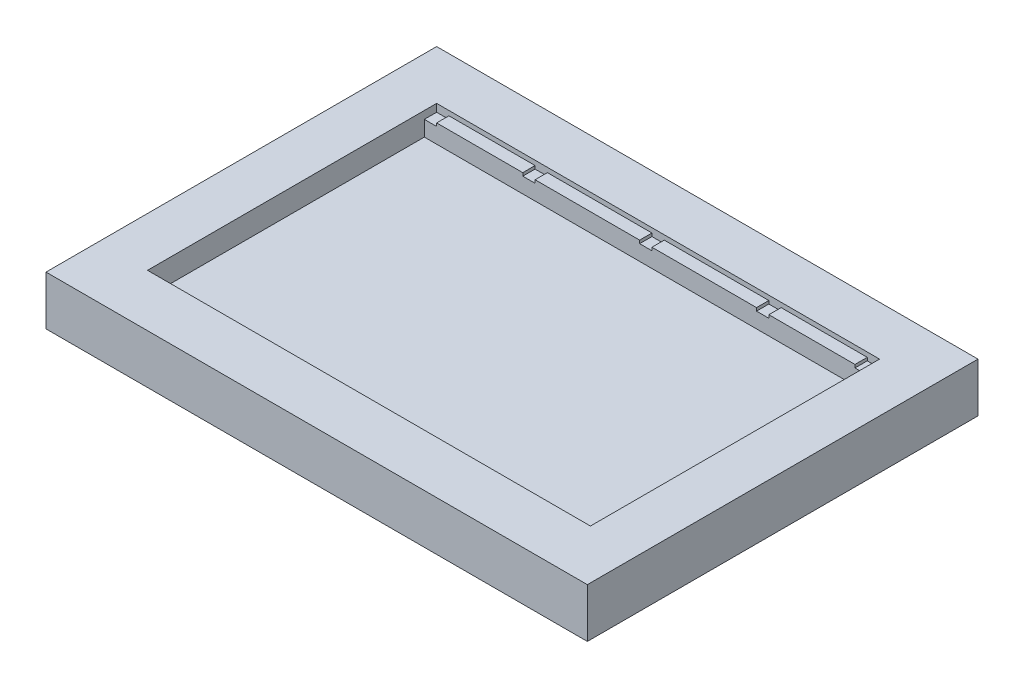
ISO-10303-21;
HEADER;
FILE_DESCRIPTION(('STEP AP214'),'2;1');
FILE_NAME('part.step','',(''),(''),'','','');
FILE_SCHEMA(('AUTOMOTIVE_DESIGN { 1 0 10303 214 1 1 1 1 }'));
ENDSEC;
DATA;
#1=APPLICATION_CONTEXT('core data for automotive mechanical design processes');
#2=APPLICATION_PROTOCOL_DEFINITION('international standard','automotive_design',2000,#1);
#3=PRODUCT_CONTEXT('',#1,'mechanical');
#4=PRODUCT('Part','Part','',(#3));
#5=PRODUCT_RELATED_PRODUCT_CATEGORY('part','',(#4));
#6=PRODUCT_DEFINITION_FORMATION('','',#4);
#7=PRODUCT_DEFINITION_CONTEXT('part definition',#1,'design');
#8=PRODUCT_DEFINITION('design','',#6,#7);
#9=PRODUCT_DEFINITION_SHAPE('','',#8);
#10=(LENGTH_UNIT() NAMED_UNIT(*) SI_UNIT(.MILLI.,.METRE.));
#11=(NAMED_UNIT(*) PLANE_ANGLE_UNIT() SI_UNIT($,.RADIAN.));
#12=(NAMED_UNIT(*) SI_UNIT($,.STERADIAN.) SOLID_ANGLE_UNIT());
#13=UNCERTAINTY_MEASURE_WITH_UNIT(LENGTH_MEASURE(1.E-05),#10,'distance_accuracy_value','');
#14=(GEOMETRIC_REPRESENTATION_CONTEXT(3) GLOBAL_UNCERTAINTY_ASSIGNED_CONTEXT((#13)) GLOBAL_UNIT_ASSIGNED_CONTEXT((#10,
#11,#12)) REPRESENTATION_CONTEXT('',''));
#15=CARTESIAN_POINT('',(0.,0.,0.));
#16=DIRECTION('',(0.,0.,1.));
#17=DIRECTION('',(1.,0.,0.));
#18=AXIS2_PLACEMENT_3D('',#15,#16,#17);
#19=CARTESIAN_POINT('',(0.,19.05,0.));
#20=DIRECTION('',(0.,1.,0.));
#21=DIRECTION('',(0.,0.,1.));
#22=AXIS2_PLACEMENT_3D('',#19,#20,#21);
#23=PLANE('',#22);
#24=DIRECTION('',(-1.,0.,0.));
#25=VECTOR('',#24,1.);
#26=CARTESIAN_POINT('',(0.,19.05,-285.75));
#27=LINE('',#26,#25);
#28=CARTESIAN_POINT('',(444.5,19.05,-285.75));
#29=VERTEX_POINT('',#28);
#30=CARTESIAN_POINT('',(355.6,19.05,-285.75));
#31=VERTEX_POINT('',#30);
#32=EDGE_CURVE('E11',#29,#31,#27,.T.);
#33=ORIENTED_EDGE('',*,*,#32,.F.);
#34=DIRECTION('',(0.,0.,1.));
#35=VECTOR('',#34,1.);
#36=CARTESIAN_POINT('',(444.5,19.05,-282.575));
#37=LINE('',#36,#35);
#38=CARTESIAN_POINT('',(444.5,19.05,-298.45));
#39=VERTEX_POINT('',#38);
#40=EDGE_CURVE('E472',#39,#29,#37,.T.);
#41=ORIENTED_EDGE('',*,*,#40,.F.);
#42=DIRECTION('',(-1.,0.,0.));
#43=VECTOR('',#42,1.);
#44=CARTESIAN_POINT('',(457.2,19.05,-298.45));
#45=LINE('',#44,#43);
#46=CARTESIAN_POINT('',(355.6,19.05,-298.45));
#47=VERTEX_POINT('',#46);
#48=EDGE_CURVE('E482',#39,#47,#45,.T.);
#49=ORIENTED_EDGE('',*,*,#48,.T.);
#50=DIRECTION('',(0.,0.,-1.));
#51=VECTOR('',#50,1.);
#52=CARTESIAN_POINT('',(355.6,19.05,-282.575));
#53=LINE('',#52,#51);
#54=EDGE_CURVE('E448',#31,#47,#53,.T.);
#55=ORIENTED_EDGE('',*,*,#54,.F.);
#56=EDGE_LOOP('',(#33,#41,#49,#55));
#57=FACE_BOUND('',#56,.T.);
#58=ADVANCED_FACE('F37',(#57),#23,.T.);
#59=CARTESIAN_POINT('',(342.9,19.05,-285.75));
#60=VERTEX_POINT('',#59);
#61=CARTESIAN_POINT('',(234.95,19.05,-285.75));
#62=VERTEX_POINT('',#61);
#63=EDGE_CURVE('E47',#60,#62,#27,.T.);
#64=ORIENTED_EDGE('',*,*,#63,.F.);
#65=DIRECTION('',(0.,0.,1.));
#66=VECTOR('',#65,1.);
#67=CARTESIAN_POINT('',(342.9,19.05,-282.575));
#68=LINE('',#67,#66);
#69=CARTESIAN_POINT('',(342.9,19.05,-298.45));
#70=VERTEX_POINT('',#69);
#71=EDGE_CURVE('E450',#70,#60,#68,.T.);
#72=ORIENTED_EDGE('',*,*,#71,.F.);
#73=CARTESIAN_POINT('',(234.95,19.05,-298.45));
#74=VERTEX_POINT('',#73);
#75=EDGE_CURVE('E499',#70,#74,#45,.T.);
#76=ORIENTED_EDGE('',*,*,#75,.T.);
#77=DIRECTION('',(0.,0.,-1.));
#78=VECTOR('',#77,1.);
#79=CARTESIAN_POINT('',(234.95,19.05,-282.575));
#80=LINE('',#79,#78);
#81=EDGE_CURVE('E409',#62,#74,#80,.T.);
#82=ORIENTED_EDGE('',*,*,#81,.F.);
#83=EDGE_LOOP('',(#64,#72,#76,#82));
#84=FACE_BOUND('',#83,.T.);
#85=ADVANCED_FACE('F311',(#84),#23,.T.);
#86=CARTESIAN_POINT('',(222.25,19.05,-285.75));
#87=VERTEX_POINT('',#86);
#88=CARTESIAN_POINT('',(114.3,19.05,-285.75));
#89=VERTEX_POINT('',#88);
#90=EDGE_CURVE('E398',#87,#89,#27,.T.);
#91=ORIENTED_EDGE('',*,*,#90,.F.);
#92=DIRECTION('',(0.,0.,1.));
#93=VECTOR('',#92,1.);
#94=CARTESIAN_POINT('',(222.25,19.05,-282.575));
#95=LINE('',#94,#93);
#96=CARTESIAN_POINT('',(222.25,19.05,-298.45));
#97=VERTEX_POINT('',#96);
#98=EDGE_CURVE('E401',#97,#87,#95,.T.);
#99=ORIENTED_EDGE('',*,*,#98,.F.);
#100=CARTESIAN_POINT('',(114.3,19.05,-298.45));
#101=VERTEX_POINT('',#100);
#102=EDGE_CURVE('E522',#97,#101,#45,.T.);
#103=ORIENTED_EDGE('',*,*,#102,.T.);
#104=DIRECTION('',(0.,0.,-1.));
#105=VECTOR('',#104,1.);
#106=CARTESIAN_POINT('',(114.3,19.05,-282.575));
#107=LINE('',#106,#105);
#108=EDGE_CURVE('E403',#89,#101,#107,.T.);
#109=ORIENTED_EDGE('',*,*,#108,.F.);
#110=EDGE_LOOP('',(#91,#99,#103,#109));
#111=FACE_BOUND('',#110,.T.);
#112=ADVANCED_FACE('F304',(#111),#23,.T.);
#113=CARTESIAN_POINT('',(0.,3.175,0.));
#114=DIRECTION('',(1.,0.,0.));
#115=DIRECTION('',(0.,0.,-1.));
#116=AXIS2_PLACEMENT_3D('',#113,#114,#115);
#117=PLANE('',#116);
#118=DIRECTION('',(0.,0.,-1.));
#119=VECTOR('',#118,1.);
#120=CARTESIAN_POINT('',(0.,23.8125,0.));
#121=LINE('',#120,#119);
#122=CARTESIAN_POINT('',(0.,23.8125,0.));
#123=VERTEX_POINT('',#122);
#124=CARTESIAN_POINT('',(0.,23.8125,-298.45));
#125=VERTEX_POINT('',#124);
#126=EDGE_CURVE('E41',#123,#125,#121,.T.);
#127=ORIENTED_EDGE('',*,*,#126,.F.);
#128=DIRECTION('',(0.,-1.,0.));
#129=VECTOR('',#128,1.);
#130=CARTESIAN_POINT('',(0.,3.175,0.));
#131=LINE('',#130,#129);
#132=CARTESIAN_POINT('',(0.,0.,0.));
#133=VERTEX_POINT('',#132);
#134=EDGE_CURVE('E211',#123,#133,#131,.T.);
#135=ORIENTED_EDGE('',*,*,#134,.T.);
#136=DIRECTION('',(0.,0.,1.));
#137=VECTOR('',#136,1.);
#138=CARTESIAN_POINT('',(0.,0.,0.));
#139=LINE('',#138,#137);
#140=CARTESIAN_POINT('',(0.,0.,-285.75));
#141=VERTEX_POINT('',#140);
#142=EDGE_CURVE('E572',#141,#133,#139,.T.);
#143=ORIENTED_EDGE('',*,*,#142,.F.);
#144=DIRECTION('',(0.,-1.,0.));
#145=VECTOR('',#144,1.);
#146=CARTESIAN_POINT('',(0.,3.175,-285.75));
#147=LINE('',#146,#145);
#148=CARTESIAN_POINT('',(0.,15.875,-285.75));
#149=VERTEX_POINT('',#148);
#150=EDGE_CURVE('E570',#149,#141,#147,.T.);
#151=ORIENTED_EDGE('',*,*,#150,.F.);
#152=DIRECTION('',(0.,0.,1.));
#153=VECTOR('',#152,1.);
#154=CARTESIAN_POINT('',(0.,15.875,-282.575));
#155=LINE('',#154,#153);
#156=CARTESIAN_POINT('',(0.,15.875,-298.45));
#157=VERTEX_POINT('',#156);
#158=EDGE_CURVE('E445',#157,#149,#155,.T.);
#159=ORIENTED_EDGE('',*,*,#158,.F.);
#160=DIRECTION('',(0.,-1.,0.));
#161=VECTOR('',#160,1.);
#162=CARTESIAN_POINT('',(0.,19.05,-298.45));
#163=LINE('',#162,#161);
#164=EDGE_CURVE('E233',#125,#157,#163,.T.);
#165=ORIENTED_EDGE('',*,*,#164,.F.);
#166=EDGE_LOOP('',(#127,#135,#143,#151,#159,#165));
#167=FACE_BOUND('',#166,.T.);
#168=ADVANCED_FACE('F231',(#167),#117,.T.);
#169=CARTESIAN_POINT('',(457.2,3.175,0.));
#170=DIRECTION('',(-1.,0.,0.));
#171=DIRECTION('',(0.,0.,1.));
#172=AXIS2_PLACEMENT_3D('',#169,#170,#171);
#173=PLANE('',#172);
#174=DIRECTION('',(0.,-1.,0.));
#175=VECTOR('',#174,1.);
#176=CARTESIAN_POINT('',(457.2,3.175,0.));
#177=LINE('',#176,#175);
#178=CARTESIAN_POINT('',(457.2,23.8125,0.));
#179=VERTEX_POINT('',#178);
#180=CARTESIAN_POINT('',(457.2,0.,0.));
#181=VERTEX_POINT('',#180);
#182=EDGE_CURVE('E222',#179,#181,#177,.T.);
#183=ORIENTED_EDGE('',*,*,#182,.F.);
#184=DIRECTION('',(0.,0.,1.));
#185=VECTOR('',#184,1.);
#186=CARTESIAN_POINT('',(457.2,23.8125,0.));
#187=LINE('',#186,#185);
#188=CARTESIAN_POINT('',(457.2,23.8125,-298.45));
#189=VERTEX_POINT('',#188);
#190=EDGE_CURVE('E229',#189,#179,#187,.T.);
#191=ORIENTED_EDGE('',*,*,#190,.F.);
#192=DIRECTION('',(0.,-1.,0.));
#193=VECTOR('',#192,1.);
#194=CARTESIAN_POINT('',(457.2,19.05,-298.45));
#195=LINE('',#194,#193);
#196=CARTESIAN_POINT('',(457.2,15.875,-298.45));
#197=VERTEX_POINT('',#196);
#198=EDGE_CURVE('E466',#189,#197,#195,.T.);
#199=ORIENTED_EDGE('',*,*,#198,.T.);
#200=DIRECTION('',(0.,0.,-1.));
#201=VECTOR('',#200,1.);
#202=CARTESIAN_POINT('',(457.2,15.875,-282.575));
#203=LINE('',#202,#201);
#204=CARTESIAN_POINT('',(457.2,15.875,-285.75));
#205=VERTEX_POINT('',#204);
#206=EDGE_CURVE('E480',#205,#197,#203,.T.);
#207=ORIENTED_EDGE('',*,*,#206,.F.);
#208=DIRECTION('',(0.,-1.,0.));
#209=VECTOR('',#208,1.);
#210=CARTESIAN_POINT('',(457.2,3.175,-285.75));
#211=LINE('',#210,#209);
#212=CARTESIAN_POINT('',(457.2,0.,-285.75));
#213=VERTEX_POINT('',#212);
#214=EDGE_CURVE('E582',#205,#213,#211,.T.);
#215=ORIENTED_EDGE('',*,*,#214,.T.);
#216=DIRECTION('',(0.,0.,-1.));
#217=VECTOR('',#216,1.);
#218=CARTESIAN_POINT('',(457.2,0.,0.));
#219=LINE('',#218,#217);
#220=EDGE_CURVE('E576',#181,#213,#219,.T.);
#221=ORIENTED_EDGE('',*,*,#220,.F.);
#222=EDGE_LOOP('',(#183,#191,#199,#207,#215,#221));
#223=FACE_BOUND('',#222,.T.);
#224=ADVANCED_FACE('F322',(#223),#173,.T.);
#225=CARTESIAN_POINT('',(0.,3.175,0.));
#226=DIRECTION('',(0.,0.,-1.));
#227=DIRECTION('',(-1.,0.,0.));
#228=AXIS2_PLACEMENT_3D('',#225,#226,#227);
#229=PLANE('',#228);
#230=ORIENTED_EDGE('',*,*,#134,.F.);
#231=DIRECTION('',(1.,0.,0.));
#232=VECTOR('',#231,1.);
#233=CARTESIAN_POINT('',(0.,23.8125,0.));
#234=LINE('',#233,#232);
#235=EDGE_CURVE('E214',#123,#179,#234,.T.);
#236=ORIENTED_EDGE('',*,*,#235,.T.);
#237=ORIENTED_EDGE('',*,*,#182,.T.);
#238=DIRECTION('',(1.,0.,0.));
#239=VECTOR('',#238,1.);
#240=CARTESIAN_POINT('',(0.,0.,0.));
#241=LINE('',#240,#239);
#242=EDGE_CURVE('E217',#133,#181,#241,.T.);
#243=ORIENTED_EDGE('',*,*,#242,.F.);
#244=EDGE_LOOP('',(#230,#236,#237,#243));
#245=FACE_BOUND('',#244,.T.);
#246=ADVANCED_FACE('F213',(#245),#229,.T.);
#247=CARTESIAN_POINT('',(0.,0.,0.));
#248=DIRECTION('',(0.,-1.,0.));
#249=DIRECTION('',(0.,0.,-1.));
#250=AXIS2_PLACEMENT_3D('',#247,#248,#249);
#251=PLANE('',#250);
#252=ORIENTED_EDGE('',*,*,#142,.T.);
#253=ORIENTED_EDGE('',*,*,#242,.T.);
#254=ORIENTED_EDGE('',*,*,#220,.T.);
#255=DIRECTION('',(-1.,0.,0.));
#256=VECTOR('',#255,1.);
#257=CARTESIAN_POINT('',(0.,0.,-285.75));
#258=LINE('',#257,#256);
#259=EDGE_CURVE('E579',#213,#141,#258,.T.);
#260=ORIENTED_EDGE('',*,*,#259,.T.);
#261=EDGE_LOOP('',(#252,#253,#254,#260));
#262=FACE_BOUND('',#261,.T.);
#263=ADVANCED_FACE('F321',(#262),#251,.F.);
#264=CARTESIAN_POINT('',(0.,3.175,-285.75));
#265=DIRECTION('',(0.,0.,1.));
#266=DIRECTION('',(1.,0.,0.));
#267=AXIS2_PLACEMENT_3D('',#264,#265,#266);
#268=PLANE('',#267);
#269=ORIENTED_EDGE('',*,*,#259,.F.);
#270=ORIENTED_EDGE('',*,*,#214,.F.);
#271=DIRECTION('',(-1.,0.,0.));
#272=VECTOR('',#271,1.);
#273=CARTESIAN_POINT('',(444.5,15.875,-285.75));
#274=LINE('',#273,#272);
#275=CARTESIAN_POINT('',(444.5,15.875,-285.75));
#276=VERTEX_POINT('',#275);
#277=EDGE_CURVE('E515',#205,#276,#274,.T.);
#278=ORIENTED_EDGE('',*,*,#277,.T.);
#279=DIRECTION('',(0.,1.,0.));
#280=VECTOR('',#279,1.);
#281=CARTESIAN_POINT('',(444.5,15.875,-285.75));
#282=LINE('',#281,#280);
#283=EDGE_CURVE('E512',#276,#29,#282,.T.);
#284=ORIENTED_EDGE('',*,*,#283,.T.);
#285=ORIENTED_EDGE('',*,*,#32,.T.);
#286=DIRECTION('',(0.,-1.,0.));
#287=VECTOR('',#286,1.);
#288=CARTESIAN_POINT('',(355.6,15.875,-285.75));
#289=LINE('',#288,#287);
#290=CARTESIAN_POINT('',(355.6,15.875,-285.75));
#291=VERTEX_POINT('',#290);
#292=EDGE_CURVE('E583',#31,#291,#289,.T.);
#293=ORIENTED_EDGE('',*,*,#292,.T.);
#294=DIRECTION('',(-1.,0.,0.));
#295=VECTOR('',#294,1.);
#296=CARTESIAN_POINT('',(342.9,15.875,-285.75));
#297=LINE('',#296,#295);
#298=CARTESIAN_POINT('',(342.9,15.875,-285.75));
#299=VERTEX_POINT('',#298);
#300=EDGE_CURVE('E503',#291,#299,#297,.T.);
#301=ORIENTED_EDGE('',*,*,#300,.T.);
#302=DIRECTION('',(0.,1.,0.));
#303=VECTOR('',#302,1.);
#304=CARTESIAN_POINT('',(342.9,15.875,-285.75));
#305=LINE('',#304,#303);
#306=EDGE_CURVE('E585',#299,#60,#305,.T.);
#307=ORIENTED_EDGE('',*,*,#306,.T.);
#308=ORIENTED_EDGE('',*,*,#63,.T.);
#309=DIRECTION('',(0.,-1.,0.));
#310=VECTOR('',#309,1.);
#311=CARTESIAN_POINT('',(234.95,15.875,-285.75));
#312=LINE('',#311,#310);
#313=CARTESIAN_POINT('',(234.95,15.875,-285.75));
#314=VERTEX_POINT('',#313);
#315=EDGE_CURVE('E547',#62,#314,#312,.T.);
#316=ORIENTED_EDGE('',*,*,#315,.T.);
#317=DIRECTION('',(-1.,0.,0.));
#318=VECTOR('',#317,1.);
#319=CARTESIAN_POINT('',(222.25,15.875,-285.75));
#320=LINE('',#319,#318);
#321=CARTESIAN_POINT('',(222.25,15.875,-285.75));
#322=VERTEX_POINT('',#321);
#323=EDGE_CURVE('E543',#314,#322,#320,.T.);
#324=ORIENTED_EDGE('',*,*,#323,.T.);
#325=DIRECTION('',(0.,1.,0.));
#326=VECTOR('',#325,1.);
#327=CARTESIAN_POINT('',(222.25,15.875,-285.75));
#328=LINE('',#327,#326);
#329=EDGE_CURVE('E62',#322,#87,#328,.T.);
#330=ORIENTED_EDGE('',*,*,#329,.T.);
#331=ORIENTED_EDGE('',*,*,#90,.T.);
#332=DIRECTION('',(0.,-1.,0.));
#333=VECTOR('',#332,1.);
#334=CARTESIAN_POINT('',(114.3,15.875,-285.75));
#335=LINE('',#334,#333);
#336=CARTESIAN_POINT('',(114.3,15.875,-285.75));
#337=VERTEX_POINT('',#336);
#338=EDGE_CURVE('E531',#89,#337,#335,.T.);
#339=ORIENTED_EDGE('',*,*,#338,.T.);
#340=DIRECTION('',(-1.,0.,0.));
#341=VECTOR('',#340,1.);
#342=CARTESIAN_POINT('',(101.6,15.875,-285.75));
#343=LINE('',#342,#341);
#344=CARTESIAN_POINT('',(101.6,15.875,-285.75));
#345=VERTEX_POINT('',#344);
#346=EDGE_CURVE('E548',#337,#345,#343,.T.);
#347=ORIENTED_EDGE('',*,*,#346,.T.);
#348=DIRECTION('',(0.,1.,0.));
#349=VECTOR('',#348,1.);
#350=CARTESIAN_POINT('',(101.6,15.875,-285.75));
#351=LINE('',#350,#349);
#352=CARTESIAN_POINT('',(101.6,19.05,-285.75));
#353=VERTEX_POINT('',#352);
#354=EDGE_CURVE('E55',#345,#353,#351,.T.);
#355=ORIENTED_EDGE('',*,*,#354,.T.);
#356=CARTESIAN_POINT('',(12.7,19.05,-285.75));
#357=VERTEX_POINT('',#356);
#358=EDGE_CURVE('E48',#353,#357,#27,.T.);
#359=ORIENTED_EDGE('',*,*,#358,.T.);
#360=DIRECTION('',(0.,-1.,0.));
#361=VECTOR('',#360,1.);
#362=CARTESIAN_POINT('',(12.7,15.875,-285.75));
#363=LINE('',#362,#361);
#364=CARTESIAN_POINT('',(12.7,15.875,-285.75));
#365=VERTEX_POINT('',#364);
#366=EDGE_CURVE('E519',#357,#365,#363,.T.);
#367=ORIENTED_EDGE('',*,*,#366,.T.);
#368=DIRECTION('',(-1.,0.,0.));
#369=VECTOR('',#368,1.);
#370=CARTESIAN_POINT('',(0.,15.875,-285.75));
#371=LINE('',#370,#369);
#372=EDGE_CURVE('E550',#365,#149,#371,.T.);
#373=ORIENTED_EDGE('',*,*,#372,.T.);
#374=ORIENTED_EDGE('',*,*,#150,.T.);
#375=EDGE_LOOP('',(#269,#270,#278,#284,#285,#293,#301,#307,#308,#316,#324,#330,#331,#339,#347,
#355,#359,#367,#373,#374));
#376=FACE_BOUND('',#375,.T.);
#377=ADVANCED_FACE('F323',(#376),#268,.T.);
#378=CARTESIAN_POINT('',(0.,15.875,0.));
#379=DIRECTION('',(0.,-1.,0.));
#380=DIRECTION('',(0.,0.,-1.));
#381=AXIS2_PLACEMENT_3D('',#378,#379,#380);
#382=PLANE('',#381);
#383=ORIENTED_EDGE('',*,*,#277,.F.);
#384=ORIENTED_EDGE('',*,*,#206,.T.);
#385=DIRECTION('',(-1.,0.,0.));
#386=VECTOR('',#385,1.);
#387=CARTESIAN_POINT('',(457.2,15.875,-298.45));
#388=LINE('',#387,#386);
#389=CARTESIAN_POINT('',(444.5,15.875,-298.45));
#390=VERTEX_POINT('',#389);
#391=EDGE_CURVE('E478',#197,#390,#388,.T.);
#392=ORIENTED_EDGE('',*,*,#391,.T.);
#393=DIRECTION('',(0.,0.,1.));
#394=VECTOR('',#393,1.);
#395=CARTESIAN_POINT('',(444.5,15.875,-282.575));
#396=LINE('',#395,#394);
#397=EDGE_CURVE('E475',#390,#276,#396,.T.);
#398=ORIENTED_EDGE('',*,*,#397,.T.);
#399=EDGE_LOOP('',(#383,#384,#392,#398));
#400=FACE_BOUND('',#399,.T.);
#401=ADVANCED_FACE('F326',(#400),#382,.F.);
#402=CARTESIAN_POINT('',(0.,19.05,-298.45));
#403=DIRECTION('',(0.,0.,1.));
#404=DIRECTION('',(1.,0.,0.));
#405=AXIS2_PLACEMENT_3D('',#402,#403,#404);
#406=PLANE('',#405);
#407=DIRECTION('',(-1.,0.,0.));
#408=VECTOR('',#407,1.);
#409=CARTESIAN_POINT('',(0.,15.875,-298.45));
#410=LINE('',#409,#408);
#411=CARTESIAN_POINT('',(12.7,15.875,-298.45));
#412=VERTEX_POINT('',#411);
#413=EDGE_CURVE('E562',#412,#157,#410,.T.);
#414=ORIENTED_EDGE('',*,*,#413,.F.);
#415=DIRECTION('',(0.,-1.,0.));
#416=VECTOR('',#415,1.);
#417=CARTESIAN_POINT('',(12.7,19.05,-298.45));
#418=LINE('',#417,#416);
#419=CARTESIAN_POINT('',(12.7,19.05,-298.45));
#420=VERTEX_POINT('',#419);
#421=EDGE_CURVE('E556',#420,#412,#418,.T.);
#422=ORIENTED_EDGE('',*,*,#421,.F.);
#423=CARTESIAN_POINT('',(101.6,19.05,-298.45));
#424=VERTEX_POINT('',#423);
#425=EDGE_CURVE('E249',#424,#420,#45,.T.);
#426=ORIENTED_EDGE('',*,*,#425,.F.);
#427=DIRECTION('',(0.,-1.,0.));
#428=VECTOR('',#427,1.);
#429=CARTESIAN_POINT('',(101.6,19.05,-298.45));
#430=LINE('',#429,#428);
#431=CARTESIAN_POINT('',(101.6,15.875,-298.45));
#432=VERTEX_POINT('',#431);
#433=EDGE_CURVE('E437',#424,#432,#430,.T.);
#434=ORIENTED_EDGE('',*,*,#433,.T.);
#435=DIRECTION('',(-1.,0.,0.));
#436=VECTOR('',#435,1.);
#437=CARTESIAN_POINT('',(101.6,15.875,-298.45));
#438=LINE('',#437,#436);
#439=CARTESIAN_POINT('',(114.3,15.875,-298.45));
#440=VERTEX_POINT('',#439);
#441=EDGE_CURVE('E434',#440,#432,#438,.T.);
#442=ORIENTED_EDGE('',*,*,#441,.F.);
#443=DIRECTION('',(0.,-1.,0.));
#444=VECTOR('',#443,1.);
#445=CARTESIAN_POINT('',(114.3,19.05,-298.45));
#446=LINE('',#445,#444);
#447=EDGE_CURVE('E440',#101,#440,#446,.T.);
#448=ORIENTED_EDGE('',*,*,#447,.F.);
#449=ORIENTED_EDGE('',*,*,#102,.F.);
#450=DIRECTION('',(0.,-1.,0.));
#451=VECTOR('',#450,1.);
#452=CARTESIAN_POINT('',(222.25,19.05,-298.45));
#453=LINE('',#452,#451);
#454=CARTESIAN_POINT('',(222.25,15.875,-298.45));
#455=VERTEX_POINT('',#454);
#456=EDGE_CURVE('E408',#97,#455,#453,.T.);
#457=ORIENTED_EDGE('',*,*,#456,.T.);
#458=DIRECTION('',(-1.,0.,0.));
#459=VECTOR('',#458,1.);
#460=CARTESIAN_POINT('',(222.25,15.875,-298.45));
#461=LINE('',#460,#459);
#462=CARTESIAN_POINT('',(234.95,15.875,-298.45));
#463=VERTEX_POINT('',#462);
#464=EDGE_CURVE('E410',#463,#455,#461,.T.);
#465=ORIENTED_EDGE('',*,*,#464,.F.);
#466=DIRECTION('',(0.,-1.,0.));
#467=VECTOR('',#466,1.);
#468=CARTESIAN_POINT('',(234.95,19.05,-298.45));
#469=LINE('',#468,#467);
#470=EDGE_CURVE('E423',#74,#463,#469,.T.);
#471=ORIENTED_EDGE('',*,*,#470,.F.);
#472=ORIENTED_EDGE('',*,*,#75,.F.);
#473=DIRECTION('',(0.,-1.,0.));
#474=VECTOR('',#473,1.);
#475=CARTESIAN_POINT('',(342.9,19.05,-298.45));
#476=LINE('',#475,#474);
#477=CARTESIAN_POINT('',(342.9,15.875,-298.45));
#478=VERTEX_POINT('',#477);
#479=EDGE_CURVE('E486',#70,#478,#476,.T.);
#480=ORIENTED_EDGE('',*,*,#479,.T.);
#481=DIRECTION('',(-1.,0.,0.));
#482=VECTOR('',#481,1.);
#483=CARTESIAN_POINT('',(355.6,15.875,-298.45));
#484=LINE('',#483,#482);
#485=CARTESIAN_POINT('',(355.6,15.875,-298.45));
#486=VERTEX_POINT('',#485);
#487=EDGE_CURVE('E461',#486,#478,#484,.T.);
#488=ORIENTED_EDGE('',*,*,#487,.F.);
#489=DIRECTION('',(0.,-1.,0.));
#490=VECTOR('',#489,1.);
#491=CARTESIAN_POINT('',(355.6,19.05,-298.45));
#492=LINE('',#491,#490);
#493=EDGE_CURVE('E483',#47,#486,#492,.T.);
#494=ORIENTED_EDGE('',*,*,#493,.F.);
#495=ORIENTED_EDGE('',*,*,#48,.F.);
#496=DIRECTION('',(0.,-1.,0.));
#497=VECTOR('',#496,1.);
#498=CARTESIAN_POINT('',(444.5,19.05,-298.45));
#499=LINE('',#498,#497);
#500=EDGE_CURVE('E469',#39,#390,#499,.T.);
#501=ORIENTED_EDGE('',*,*,#500,.T.);
#502=ORIENTED_EDGE('',*,*,#391,.F.);
#503=ORIENTED_EDGE('',*,*,#198,.F.);
#504=DIRECTION('',(-1.,0.,0.));
#505=VECTOR('',#504,1.);
#506=CARTESIAN_POINT('',(457.2,23.8125,-298.45));
#507=LINE('',#506,#505);
#508=EDGE_CURVE('E517',#189,#125,#507,.T.);
#509=ORIENTED_EDGE('',*,*,#508,.T.);
#510=ORIENTED_EDGE('',*,*,#164,.T.);
#511=EDGE_LOOP('',(#414,#422,#426,#434,#442,#448,#449,#457,#465,#471,#472,#480,#488,#494,#495,
#501,#502,#503,#509,#510));
#512=FACE_BOUND('',#511,.T.);
#513=ADVANCED_FACE('F361',(#512),#406,.T.);
#514=CARTESIAN_POINT('',(0.,15.875,0.));
#515=DIRECTION('',(0.,-1.,0.));
#516=DIRECTION('',(0.,0.,-1.));
#517=AXIS2_PLACEMENT_3D('',#514,#515,#516);
#518=PLANE('',#517);
#519=ORIENTED_EDGE('',*,*,#372,.F.);
#520=DIRECTION('',(0.,0.,-1.));
#521=VECTOR('',#520,1.);
#522=CARTESIAN_POINT('',(12.7,15.875,-282.575));
#523=LINE('',#522,#521);
#524=EDGE_CURVE('E564',#365,#412,#523,.T.);
#525=ORIENTED_EDGE('',*,*,#524,.T.);
#526=ORIENTED_EDGE('',*,*,#413,.T.);
#527=ORIENTED_EDGE('',*,*,#158,.T.);
#528=EDGE_LOOP('',(#519,#525,#526,#527));
#529=FACE_BOUND('',#528,.T.);
#530=ADVANCED_FACE('F334',(#529),#518,.F.);
#531=CARTESIAN_POINT('',(12.7,15.875,-285.75));
#532=DIRECTION('',(-1.,0.,0.));
#533=DIRECTION('',(0.,0.,1.));
#534=AXIS2_PLACEMENT_3D('',#531,#532,#533);
#535=PLANE('',#534);
#536=ORIENTED_EDGE('',*,*,#366,.F.);
#537=DIRECTION('',(0.,0.,-1.));
#538=VECTOR('',#537,1.);
#539=CARTESIAN_POINT('',(12.7,19.05,-282.575));
#540=LINE('',#539,#538);
#541=EDGE_CURVE('E560',#357,#420,#540,.T.);
#542=ORIENTED_EDGE('',*,*,#541,.T.);
#543=ORIENTED_EDGE('',*,*,#421,.T.);
#544=ORIENTED_EDGE('',*,*,#524,.F.);
#545=EDGE_LOOP('',(#536,#542,#543,#544));
#546=FACE_BOUND('',#545,.T.);
#547=ADVANCED_FACE('F330',(#546),#535,.T.);
#548=CARTESIAN_POINT('',(101.6,15.875,-285.75));
#549=DIRECTION('',(1.,0.,0.));
#550=DIRECTION('',(0.,0.,-1.));
#551=AXIS2_PLACEMENT_3D('',#548,#549,#550);
#552=PLANE('',#551);
#553=ORIENTED_EDGE('',*,*,#354,.F.);
#554=DIRECTION('',(0.,0.,1.));
#555=VECTOR('',#554,1.);
#556=CARTESIAN_POINT('',(101.6,15.875,-282.575));
#557=LINE('',#556,#555);
#558=EDGE_CURVE('E428',#432,#345,#557,.T.);
#559=ORIENTED_EDGE('',*,*,#558,.F.);
#560=ORIENTED_EDGE('',*,*,#433,.F.);
#561=DIRECTION('',(0.,0.,1.));
#562=VECTOR('',#561,1.);
#563=CARTESIAN_POINT('',(101.6,19.05,-282.575));
#564=LINE('',#563,#562);
#565=EDGE_CURVE('E431',#424,#353,#564,.T.);
#566=ORIENTED_EDGE('',*,*,#565,.T.);
#567=EDGE_LOOP('',(#553,#559,#560,#566));
#568=FACE_BOUND('',#567,.T.);
#569=ADVANCED_FACE('F333',(#568),#552,.T.);
#570=CARTESIAN_POINT('',(0.,15.875,0.));
#571=DIRECTION('',(0.,-1.,0.));
#572=DIRECTION('',(0.,0.,-1.));
#573=AXIS2_PLACEMENT_3D('',#570,#571,#572);
#574=PLANE('',#573);
#575=ORIENTED_EDGE('',*,*,#346,.F.);
#576=DIRECTION('',(0.,0.,-1.));
#577=VECTOR('',#576,1.);
#578=CARTESIAN_POINT('',(114.3,15.875,-282.575));
#579=LINE('',#578,#577);
#580=EDGE_CURVE('E530',#337,#440,#579,.T.);
#581=ORIENTED_EDGE('',*,*,#580,.T.);
#582=ORIENTED_EDGE('',*,*,#441,.T.);
#583=ORIENTED_EDGE('',*,*,#558,.T.);
#584=EDGE_LOOP('',(#575,#581,#582,#583));
#585=FACE_BOUND('',#584,.T.);
#586=ADVANCED_FACE('F338',(#585),#574,.F.);
#587=CARTESIAN_POINT('',(114.3,15.875,-285.75));
#588=DIRECTION('',(-1.,0.,0.));
#589=DIRECTION('',(0.,0.,1.));
#590=AXIS2_PLACEMENT_3D('',#587,#588,#589);
#591=PLANE('',#590);
#592=ORIENTED_EDGE('',*,*,#338,.F.);
#593=ORIENTED_EDGE('',*,*,#108,.T.);
#594=ORIENTED_EDGE('',*,*,#447,.T.);
#595=ORIENTED_EDGE('',*,*,#580,.F.);
#596=EDGE_LOOP('',(#592,#593,#594,#595));
#597=FACE_BOUND('',#596,.T.);
#598=ADVANCED_FACE('F340',(#597),#591,.T.);
#599=CARTESIAN_POINT('',(222.25,15.875,-285.75));
#600=DIRECTION('',(1.,0.,0.));
#601=DIRECTION('',(0.,0.,-1.));
#602=AXIS2_PLACEMENT_3D('',#599,#600,#601);
#603=PLANE('',#602);
#604=ORIENTED_EDGE('',*,*,#329,.F.);
#605=DIRECTION('',(0.,0.,1.));
#606=VECTOR('',#605,1.);
#607=CARTESIAN_POINT('',(222.25,15.875,-282.575));
#608=LINE('',#607,#606);
#609=EDGE_CURVE('E457',#455,#322,#608,.T.);
#610=ORIENTED_EDGE('',*,*,#609,.F.);
#611=ORIENTED_EDGE('',*,*,#456,.F.);
#612=ORIENTED_EDGE('',*,*,#98,.T.);
#613=EDGE_LOOP('',(#604,#610,#611,#612));
#614=FACE_BOUND('',#613,.T.);
#615=ADVANCED_FACE('F343',(#614),#603,.T.);
#616=CARTESIAN_POINT('',(0.,15.875,0.));
#617=DIRECTION('',(0.,-1.,0.));
#618=DIRECTION('',(0.,0.,-1.));
#619=AXIS2_PLACEMENT_3D('',#616,#617,#618);
#620=PLANE('',#619);
#621=ORIENTED_EDGE('',*,*,#323,.F.);
#622=DIRECTION('',(0.,0.,-1.));
#623=VECTOR('',#622,1.);
#624=CARTESIAN_POINT('',(234.95,15.875,-282.575));
#625=LINE('',#624,#623);
#626=EDGE_CURVE('E414',#314,#463,#625,.T.);
#627=ORIENTED_EDGE('',*,*,#626,.T.);
#628=ORIENTED_EDGE('',*,*,#464,.T.);
#629=ORIENTED_EDGE('',*,*,#609,.T.);
#630=EDGE_LOOP('',(#621,#627,#628,#629));
#631=FACE_BOUND('',#630,.T.);
#632=ADVANCED_FACE('F347',(#631),#620,.F.);
#633=CARTESIAN_POINT('',(234.95,15.875,-285.75));
#634=DIRECTION('',(-1.,0.,0.));
#635=DIRECTION('',(0.,0.,1.));
#636=AXIS2_PLACEMENT_3D('',#633,#634,#635);
#637=PLANE('',#636);
#638=ORIENTED_EDGE('',*,*,#315,.F.);
#639=ORIENTED_EDGE('',*,*,#81,.T.);
#640=ORIENTED_EDGE('',*,*,#470,.T.);
#641=ORIENTED_EDGE('',*,*,#626,.F.);
#642=EDGE_LOOP('',(#638,#639,#640,#641));
#643=FACE_BOUND('',#642,.T.);
#644=ADVANCED_FACE('F349',(#643),#637,.T.);
#645=CARTESIAN_POINT('',(342.9,15.875,-285.75));
#646=DIRECTION('',(1.,0.,0.));
#647=DIRECTION('',(0.,0.,-1.));
#648=AXIS2_PLACEMENT_3D('',#645,#646,#647);
#649=PLANE('',#648);
#650=ORIENTED_EDGE('',*,*,#306,.F.);
#651=DIRECTION('',(0.,0.,1.));
#652=VECTOR('',#651,1.);
#653=CARTESIAN_POINT('',(342.9,15.875,-282.575));
#654=LINE('',#653,#652);
#655=EDGE_CURVE('E451',#478,#299,#654,.T.);
#656=ORIENTED_EDGE('',*,*,#655,.F.);
#657=ORIENTED_EDGE('',*,*,#479,.F.);
#658=ORIENTED_EDGE('',*,*,#71,.T.);
#659=EDGE_LOOP('',(#650,#656,#657,#658));
#660=FACE_BOUND('',#659,.T.);
#661=ADVANCED_FACE('F352',(#660),#649,.T.);
#662=CARTESIAN_POINT('',(0.,15.875,0.));
#663=DIRECTION('',(0.,-1.,0.));
#664=DIRECTION('',(0.,0.,-1.));
#665=AXIS2_PLACEMENT_3D('',#662,#663,#664);
#666=PLANE('',#665);
#667=ORIENTED_EDGE('',*,*,#300,.F.);
#668=DIRECTION('',(0.,0.,-1.));
#669=VECTOR('',#668,1.);
#670=CARTESIAN_POINT('',(355.6,15.875,-282.575));
#671=LINE('',#670,#669);
#672=EDGE_CURVE('E464',#291,#486,#671,.T.);
#673=ORIENTED_EDGE('',*,*,#672,.T.);
#674=ORIENTED_EDGE('',*,*,#487,.T.);
#675=ORIENTED_EDGE('',*,*,#655,.T.);
#676=EDGE_LOOP('',(#667,#673,#674,#675));
#677=FACE_BOUND('',#676,.T.);
#678=ADVANCED_FACE('F356',(#677),#666,.F.);
#679=CARTESIAN_POINT('',(355.6,15.875,-285.75));
#680=DIRECTION('',(-1.,0.,0.));
#681=DIRECTION('',(0.,0.,1.));
#682=AXIS2_PLACEMENT_3D('',#679,#680,#681);
#683=PLANE('',#682);
#684=ORIENTED_EDGE('',*,*,#292,.F.);
#685=ORIENTED_EDGE('',*,*,#54,.T.);
#686=ORIENTED_EDGE('',*,*,#493,.T.);
#687=ORIENTED_EDGE('',*,*,#672,.F.);
#688=EDGE_LOOP('',(#684,#685,#686,#687));
#689=FACE_BOUND('',#688,.T.);
#690=ADVANCED_FACE('F307',(#689),#683,.T.);
#691=CARTESIAN_POINT('',(444.5,15.875,-285.75));
#692=DIRECTION('',(1.,0.,0.));
#693=DIRECTION('',(0.,0.,-1.));
#694=AXIS2_PLACEMENT_3D('',#691,#692,#693);
#695=PLANE('',#694);
#696=ORIENTED_EDGE('',*,*,#283,.F.);
#697=ORIENTED_EDGE('',*,*,#397,.F.);
#698=ORIENTED_EDGE('',*,*,#500,.F.);
#699=ORIENTED_EDGE('',*,*,#40,.T.);
#700=EDGE_LOOP('',(#696,#697,#698,#699));
#701=FACE_BOUND('',#700,.T.);
#702=ADVANCED_FACE('F297',(#701),#695,.T.);
#703=CARTESIAN_POINT('',(0.,-26.9875,0.));
#704=DIRECTION('',(0.,1.,0.));
#705=DIRECTION('',(0.,0.,1.));
#706=AXIS2_PLACEMENT_3D('',#703,#704,#705);
#707=PLANE('',#706);
#708=DIRECTION('',(0.,0.,-1.));
#709=VECTOR('',#708,1.);
#710=CARTESIAN_POINT('',(508.,-26.9875,53.975));
#711=LINE('',#710,#709);
#712=CARTESIAN_POINT('',(508.,-26.9875,53.975));
#713=VERTEX_POINT('',#712);
#714=CARTESIAN_POINT('',(508.,-26.9875,-349.25));
#715=VERTEX_POINT('',#714);
#716=EDGE_CURVE('E240',#713,#715,#711,.T.);
#717=ORIENTED_EDGE('',*,*,#716,.F.);
#718=DIRECTION('',(1.,0.,0.));
#719=VECTOR('',#718,1.);
#720=CARTESIAN_POINT('',(508.,-26.9875,53.975));
#721=LINE('',#720,#719);
#722=CARTESIAN_POINT('',(-50.8,-26.9875,53.9750000000001));
#723=VERTEX_POINT('',#722);
#724=EDGE_CURVE('E254',#723,#713,#721,.T.);
#725=ORIENTED_EDGE('',*,*,#724,.F.);
#726=DIRECTION('',(0.,0.,1.));
#727=VECTOR('',#726,1.);
#728=CARTESIAN_POINT('',(-50.8,-26.9875,53.9750000000001));
#729=LINE('',#728,#727);
#730=CARTESIAN_POINT('',(-50.8,-26.9875,-349.25));
#731=VERTEX_POINT('',#730);
#732=EDGE_CURVE('E272',#731,#723,#729,.T.);
#733=ORIENTED_EDGE('',*,*,#732,.F.);
#734=DIRECTION('',(-1.,0.,0.));
#735=VECTOR('',#734,1.);
#736=CARTESIAN_POINT('',(508.,-26.9875,-349.25));
#737=LINE('',#736,#735);
#738=EDGE_CURVE('E274',#715,#731,#737,.T.);
#739=ORIENTED_EDGE('',*,*,#738,.F.);
#740=EDGE_LOOP('',(#717,#725,#733,#739));
#741=FACE_BOUND('',#740,.T.);
#742=ADVANCED_FACE('F286',(#741),#707,.F.);
#743=CARTESIAN_POINT('',(508.,-26.9875,53.975));
#744=DIRECTION('',(0.,0.,1.));
#745=DIRECTION('',(1.,0.,0.));
#746=AXIS2_PLACEMENT_3D('',#743,#744,#745);
#747=PLANE('',#746);
#748=DIRECTION('',(1.,0.,0.));
#749=VECTOR('',#748,1.);
#750=CARTESIAN_POINT('',(508.,23.8125,53.975));
#751=LINE('',#750,#749);
#752=CARTESIAN_POINT('',(-50.8,23.8125,53.9750000000001));
#753=VERTEX_POINT('',#752);
#754=CARTESIAN_POINT('',(508.,23.8125,53.975));
#755=VERTEX_POINT('',#754);
#756=EDGE_CURVE('E258',#753,#755,#751,.T.);
#757=ORIENTED_EDGE('',*,*,#756,.F.);
#758=DIRECTION('',(0.,1.,0.));
#759=VECTOR('',#758,1.);
#760=CARTESIAN_POINT('',(-50.8,-26.9875,53.9750000000001));
#761=LINE('',#760,#759);
#762=EDGE_CURVE('E237',#723,#753,#761,.T.);
#763=ORIENTED_EDGE('',*,*,#762,.F.);
#764=ORIENTED_EDGE('',*,*,#724,.T.);
#765=DIRECTION('',(0.,1.,0.));
#766=VECTOR('',#765,1.);
#767=CARTESIAN_POINT('',(508.,-26.9875,53.975));
#768=LINE('',#767,#766);
#769=EDGE_CURVE('E235',#713,#755,#768,.T.);
#770=ORIENTED_EDGE('',*,*,#769,.T.);
#771=EDGE_LOOP('',(#757,#763,#764,#770));
#772=FACE_BOUND('',#771,.T.);
#773=ADVANCED_FACE('F290',(#772),#747,.T.);
#774=CARTESIAN_POINT('',(-50.8,-26.9875,53.9750000000001));
#775=DIRECTION('',(-1.,0.,0.));
#776=DIRECTION('',(0.,0.,1.));
#777=AXIS2_PLACEMENT_3D('',#774,#775,#776);
#778=PLANE('',#777);
#779=DIRECTION('',(0.,0.,1.));
#780=VECTOR('',#779,1.);
#781=CARTESIAN_POINT('',(-50.8,23.8125,53.9750000000001));
#782=LINE('',#781,#780);
#783=CARTESIAN_POINT('',(-50.8,23.8125,-349.25));
#784=VERTEX_POINT('',#783);
#785=EDGE_CURVE('E261',#784,#753,#782,.T.);
#786=ORIENTED_EDGE('',*,*,#785,.F.);
#787=DIRECTION('',(0.,1.,0.));
#788=VECTOR('',#787,1.);
#789=CARTESIAN_POINT('',(-50.8,-26.9875,-349.25));
#790=LINE('',#789,#788);
#791=EDGE_CURVE('E255',#731,#784,#790,.T.);
#792=ORIENTED_EDGE('',*,*,#791,.F.);
#793=ORIENTED_EDGE('',*,*,#732,.T.);
#794=ORIENTED_EDGE('',*,*,#762,.T.);
#795=EDGE_LOOP('',(#786,#792,#793,#794));
#796=FACE_BOUND('',#795,.T.);
#797=ADVANCED_FACE('F293',(#796),#778,.T.);
#798=CARTESIAN_POINT('',(508.,-26.9875,-349.25));
#799=DIRECTION('',(0.,0.,-1.));
#800=DIRECTION('',(-1.,0.,0.));
#801=AXIS2_PLACEMENT_3D('',#798,#799,#800);
#802=PLANE('',#801);
#803=DIRECTION('',(-1.,0.,0.));
#804=VECTOR('',#803,1.);
#805=CARTESIAN_POINT('',(508.,23.8125,-349.25));
#806=LINE('',#805,#804);
#807=CARTESIAN_POINT('',(508.,23.8125,-349.25));
#808=VERTEX_POINT('',#807);
#809=EDGE_CURVE('E264',#808,#784,#806,.T.);
#810=ORIENTED_EDGE('',*,*,#809,.F.);
#811=DIRECTION('',(0.,1.,0.));
#812=VECTOR('',#811,1.);
#813=CARTESIAN_POINT('',(508.,-26.9875,-349.25));
#814=LINE('',#813,#812);
#815=EDGE_CURVE('E252',#715,#808,#814,.T.);
#816=ORIENTED_EDGE('',*,*,#815,.F.);
#817=ORIENTED_EDGE('',*,*,#738,.T.);
#818=ORIENTED_EDGE('',*,*,#791,.T.);
#819=EDGE_LOOP('',(#810,#816,#817,#818));
#820=FACE_BOUND('',#819,.T.);
#821=ADVANCED_FACE('F294',(#820),#802,.T.);
#822=CARTESIAN_POINT('',(508.,-26.9875,53.975));
#823=DIRECTION('',(1.,0.,0.));
#824=DIRECTION('',(0.,0.,-1.));
#825=AXIS2_PLACEMENT_3D('',#822,#823,#824);
#826=PLANE('',#825);
#827=DIRECTION('',(0.,0.,-1.));
#828=VECTOR('',#827,1.);
#829=CARTESIAN_POINT('',(508.,23.8125,53.975));
#830=LINE('',#829,#828);
#831=EDGE_CURVE('E267',#755,#808,#830,.T.);
#832=ORIENTED_EDGE('',*,*,#831,.F.);
#833=ORIENTED_EDGE('',*,*,#769,.F.);
#834=ORIENTED_EDGE('',*,*,#716,.T.);
#835=ORIENTED_EDGE('',*,*,#815,.T.);
#836=EDGE_LOOP('',(#832,#833,#834,#835));
#837=FACE_BOUND('',#836,.T.);
#838=ADVANCED_FACE('F282',(#837),#826,.T.);
#839=CARTESIAN_POINT('',(0.,23.8125,0.));
#840=DIRECTION('',(0.,1.,0.));
#841=DIRECTION('',(0.,0.,1.));
#842=AXIS2_PLACEMENT_3D('',#839,#840,#841);
#843=PLANE('',#842);
#844=ORIENTED_EDGE('',*,*,#235,.F.);
#845=ORIENTED_EDGE('',*,*,#126,.T.);
#846=ORIENTED_EDGE('',*,*,#508,.F.);
#847=ORIENTED_EDGE('',*,*,#190,.T.);
#848=EDGE_LOOP('',(#844,#845,#846,#847));
#849=FACE_BOUND('',#848,.T.);
#850=ORIENTED_EDGE('',*,*,#831,.T.);
#851=ORIENTED_EDGE('',*,*,#809,.T.);
#852=ORIENTED_EDGE('',*,*,#785,.T.);
#853=ORIENTED_EDGE('',*,*,#756,.T.);
#854=EDGE_LOOP('',(#850,#851,#852,#853));
#855=FACE_BOUND('',#854,.T.);
#856=ADVANCED_FACE('F39',(#849,#855),#843,.T.);
#857=ORIENTED_EDGE('',*,*,#358,.F.);
#858=ORIENTED_EDGE('',*,*,#565,.F.);
#859=ORIENTED_EDGE('',*,*,#425,.T.);
#860=ORIENTED_EDGE('',*,*,#541,.F.);
#861=EDGE_LOOP('',(#857,#858,#859,#860));
#862=FACE_BOUND('',#861,.T.);
#863=ADVANCED_FACE('F296',(#862),#23,.T.);
#864=CLOSED_SHELL('',(#58,#85,#112,#168,#224,#246,#263,#377,#401,#513,#530,#547,#569,#586,#598,
#615,#632,#644,#661,#678,#690,#702,#742,#773,#797,#821,#838,#856,#863));
#865=MANIFOLD_SOLID_BREP('B2',#864);
#866=ADVANCED_BREP_SHAPE_REPRESENTATION('',(#18,#865),#14);
#867=SHAPE_DEFINITION_REPRESENTATION(#9,#866);
ENDSEC;
END-ISO-10303-21;
